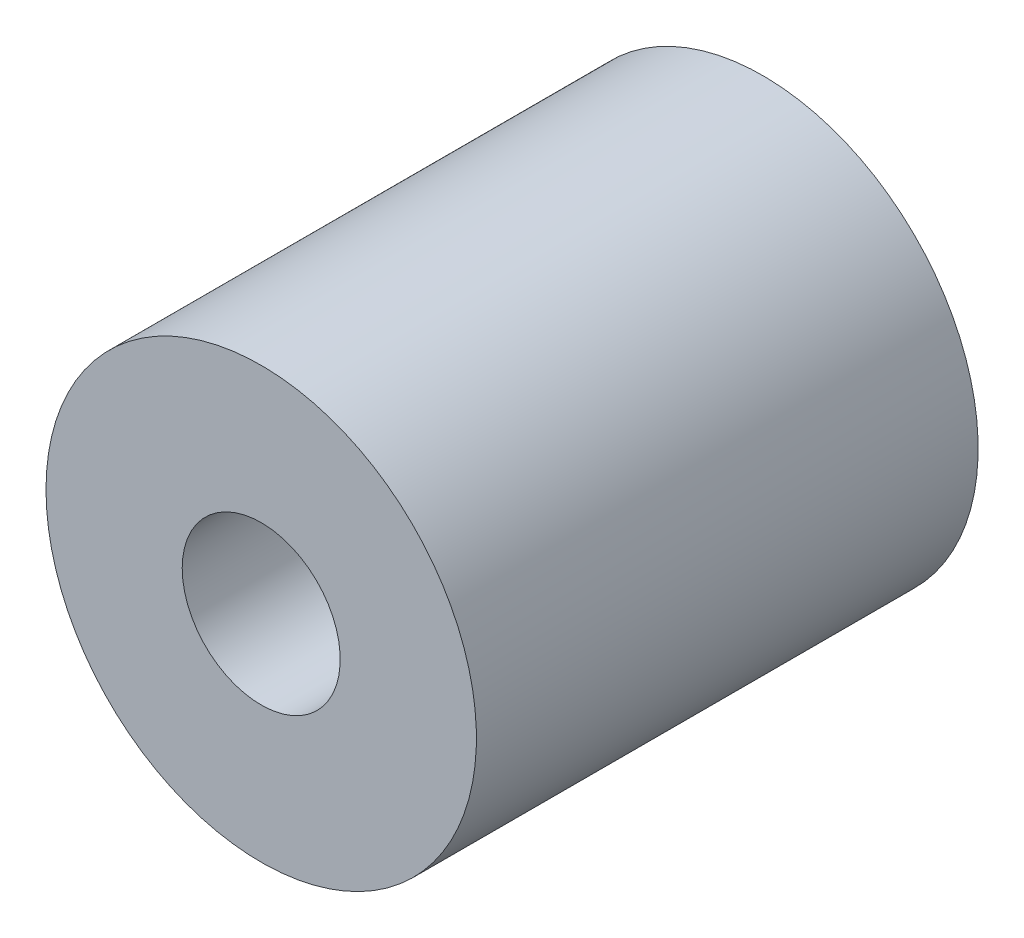
ISO-10303-21;
HEADER;
FILE_DESCRIPTION(('STEP AP214'),'2;1');
FILE_NAME('part.step','',(''),(''),'','','');
FILE_SCHEMA(('AUTOMOTIVE_DESIGN { 1 0 10303 214 1 1 1 1 }'));
ENDSEC;
DATA;
#1=APPLICATION_CONTEXT('core data for automotive mechanical design processes');
#2=APPLICATION_PROTOCOL_DEFINITION('international standard','automotive_design',2000,#1);
#3=PRODUCT_CONTEXT('',#1,'mechanical');
#4=PRODUCT('Part','Part','',(#3));
#5=PRODUCT_RELATED_PRODUCT_CATEGORY('part','',(#4));
#6=PRODUCT_DEFINITION_FORMATION('','',#4);
#7=PRODUCT_DEFINITION_CONTEXT('part definition',#1,'design');
#8=PRODUCT_DEFINITION('design','',#6,#7);
#9=PRODUCT_DEFINITION_SHAPE('','',#8);
#10=(LENGTH_UNIT() NAMED_UNIT(*) SI_UNIT(.MILLI.,.METRE.));
#11=(NAMED_UNIT(*) PLANE_ANGLE_UNIT() SI_UNIT($,.RADIAN.));
#12=(NAMED_UNIT(*) SI_UNIT($,.STERADIAN.) SOLID_ANGLE_UNIT());
#13=UNCERTAINTY_MEASURE_WITH_UNIT(LENGTH_MEASURE(1.E-05),#10,'distance_accuracy_value','');
#14=(GEOMETRIC_REPRESENTATION_CONTEXT(3) GLOBAL_UNCERTAINTY_ASSIGNED_CONTEXT((#13)) GLOBAL_UNIT_ASSIGNED_CONTEXT((#10,
#11,#12)) REPRESENTATION_CONTEXT('',''));
#15=CARTESIAN_POINT('',(0.,0.,0.));
#16=DIRECTION('',(0.,0.,1.));
#17=DIRECTION('',(1.,0.,0.));
#18=AXIS2_PLACEMENT_3D('',#15,#16,#17);
#19=CARTESIAN_POINT('',(0.,0.,-21.7308816762368));
#20=DIRECTION('',(0.,0.,-1.));
#21=DIRECTION('',(-1.,0.,0.));
#22=AXIS2_PLACEMENT_3D('',#19,#20,#21);
#23=CYLINDRICAL_SURFACE('',#22,8.88999999999999);
#24=CARTESIAN_POINT('',(0.,0.,10.3632));
#25=DIRECTION('',(0.,0.,-1.));
#26=DIRECTION('',(-1.,0.,0.));
#27=AXIS2_PLACEMENT_3D('',#24,#25,#26);
#28=CIRCLE('',#27,8.88999999999999);
#29=CARTESIAN_POINT('',(-8.88999999999999,0.,10.3632));
#30=VERTEX_POINT('',#29);
#31=EDGE_CURVE('E46',#30,#30,#28,.T.);
#32=ORIENTED_EDGE('',*,*,#31,.T.);
#33=EDGE_LOOP('',(#32));
#34=FACE_BOUND('',#33,.T.);
#35=CARTESIAN_POINT('',(0.,0.,-10.3632));
#36=DIRECTION('',(0.,0.,-1.));
#37=DIRECTION('',(-1.,0.,0.));
#38=AXIS2_PLACEMENT_3D('',#35,#36,#37);
#39=CIRCLE('',#38,8.88999999999999);
#40=CARTESIAN_POINT('',(-8.88999999999999,0.,-10.3632));
#41=VERTEX_POINT('',#40);
#42=EDGE_CURVE('E10',#41,#41,#39,.T.);
#43=ORIENTED_EDGE('',*,*,#42,.F.);
#44=EDGE_LOOP('',(#43));
#45=FACE_BOUND('',#44,.T.);
#46=ADVANCED_FACE('F32',(#34,#45),#23,.T.);
#47=CARTESIAN_POINT('',(0.,8.88999999999999,-10.3632));
#48=DIRECTION('',(0.,0.,-1.));
#49=DIRECTION('',(-1.,0.,0.));
#50=AXIS2_PLACEMENT_3D('',#47,#48,#49);
#51=PLANE('',#50);
#52=ORIENTED_EDGE('',*,*,#42,.T.);
#53=EDGE_LOOP('',(#52));
#54=FACE_BOUND('',#53,.T.);
#55=CARTESIAN_POINT('',(0.,0.,-10.3632));
#56=DIRECTION('',(0.,0.,-1.));
#57=DIRECTION('',(-1.,0.,0.));
#58=AXIS2_PLACEMENT_3D('',#55,#56,#57);
#59=CIRCLE('',#58,3.2639);
#60=CARTESIAN_POINT('',(-3.2639,0.,-10.3632));
#61=VERTEX_POINT('',#60);
#62=EDGE_CURVE('E38',#61,#61,#59,.T.);
#63=ORIENTED_EDGE('',*,*,#62,.F.);
#64=EDGE_LOOP('',(#63));
#65=FACE_BOUND('',#64,.T.);
#66=ADVANCED_FACE('F62',(#54,#65),#51,.T.);
#67=CARTESIAN_POINT('',(0.,0.,-21.7308816762368));
#68=DIRECTION('',(0.,0.,-1.));
#69=DIRECTION('',(-1.,0.,0.));
#70=AXIS2_PLACEMENT_3D('',#67,#68,#69);
#71=CYLINDRICAL_SURFACE('',#70,3.2639);
#72=ORIENTED_EDGE('',*,*,#62,.T.);
#73=EDGE_LOOP('',(#72));
#74=FACE_BOUND('',#73,.T.);
#75=CARTESIAN_POINT('',(0.,0.,10.3632));
#76=DIRECTION('',(0.,0.,-1.));
#77=DIRECTION('',(-1.,0.,0.));
#78=AXIS2_PLACEMENT_3D('',#75,#76,#77);
#79=CIRCLE('',#78,3.2639);
#80=CARTESIAN_POINT('',(-3.2639,0.,10.3632));
#81=VERTEX_POINT('',#80);
#82=EDGE_CURVE('E42',#81,#81,#79,.T.);
#83=ORIENTED_EDGE('',*,*,#82,.F.);
#84=EDGE_LOOP('',(#83));
#85=FACE_BOUND('',#84,.T.);
#86=ADVANCED_FACE('F56',(#74,#85),#71,.F.);
#87=CARTESIAN_POINT('',(0.,8.88999999999999,10.3632));
#88=DIRECTION('',(0.,0.,1.));
#89=DIRECTION('',(1.,0.,0.));
#90=AXIS2_PLACEMENT_3D('',#87,#88,#89);
#91=PLANE('',#90);
#92=ORIENTED_EDGE('',*,*,#82,.T.);
#93=EDGE_LOOP('',(#92));
#94=FACE_BOUND('',#93,.T.);
#95=ORIENTED_EDGE('',*,*,#31,.F.);
#96=EDGE_LOOP('',(#95));
#97=FACE_BOUND('',#96,.T.);
#98=ADVANCED_FACE('F54',(#94,#97),#91,.T.);
#99=CLOSED_SHELL('',(#46,#66,#86,#98));
#100=MANIFOLD_SOLID_BREP('B2',#99);
#101=ADVANCED_BREP_SHAPE_REPRESENTATION('',(#18,#100),#14);
#102=SHAPE_DEFINITION_REPRESENTATION(#9,#101);
ENDSEC;
END-ISO-10303-21;
